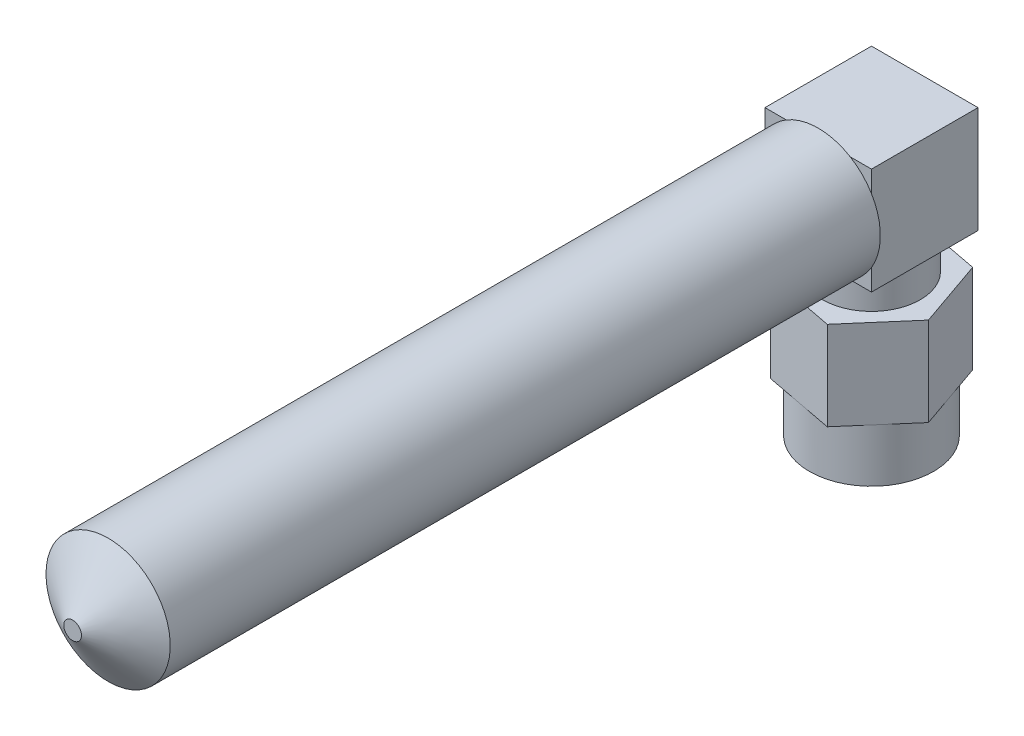
ISO-10303-21;
HEADER;
FILE_DESCRIPTION(('STEP AP214'),'2;1');
FILE_NAME('part.step','',(''),(''),'','','');
FILE_SCHEMA(('AUTOMOTIVE_DESIGN { 1 0 10303 214 1 1 1 1 }'));
ENDSEC;
DATA;
#1=APPLICATION_CONTEXT('core data for automotive mechanical design processes');
#2=APPLICATION_PROTOCOL_DEFINITION('international standard','automotive_design',2000,#1);
#3=PRODUCT_CONTEXT('',#1,'mechanical');
#4=PRODUCT('Part','Part','',(#3));
#5=PRODUCT_RELATED_PRODUCT_CATEGORY('part','',(#4));
#6=PRODUCT_DEFINITION_FORMATION('','',#4);
#7=PRODUCT_DEFINITION_CONTEXT('part definition',#1,'design');
#8=PRODUCT_DEFINITION('design','',#6,#7);
#9=PRODUCT_DEFINITION_SHAPE('','',#8);
#10=(LENGTH_UNIT() NAMED_UNIT(*) SI_UNIT(.MILLI.,.METRE.));
#11=(NAMED_UNIT(*) PLANE_ANGLE_UNIT() SI_UNIT($,.RADIAN.));
#12=(NAMED_UNIT(*) SI_UNIT($,.STERADIAN.) SOLID_ANGLE_UNIT());
#13=UNCERTAINTY_MEASURE_WITH_UNIT(LENGTH_MEASURE(1.E-05),#10,'distance_accuracy_value','');
#14=(GEOMETRIC_REPRESENTATION_CONTEXT(3) GLOBAL_UNCERTAINTY_ASSIGNED_CONTEXT((#13)) GLOBAL_UNIT_ASSIGNED_CONTEXT((#10,
#11,#12)) REPRESENTATION_CONTEXT('',''));
#15=CARTESIAN_POINT('',(0.,0.,0.));
#16=DIRECTION('',(0.,0.,1.));
#17=DIRECTION('',(1.,0.,0.));
#18=AXIS2_PLACEMENT_3D('',#15,#16,#17);
#19=CARTESIAN_POINT('',(3.,16.,3.));
#20=DIRECTION('',(0.,0.,-1.));
#21=DIRECTION('',(-1.,0.,0.));
#22=AXIS2_PLACEMENT_3D('',#19,#20,#21);
#23=PLANE('',#22);
#24=CARTESIAN_POINT('',(0.,13.,3.));
#25=DIRECTION('',(0.,0.,1.));
#26=DIRECTION('',(1.,0.,0.));
#27=AXIS2_PLACEMENT_3D('',#24,#25,#26);
#28=CIRCLE('',#27,3.5);
#29=CARTESIAN_POINT('',(3.,14.802775637732,3.));
#30=VERTEX_POINT('',#29);
#31=CARTESIAN_POINT('',(1.802775637732,16.,3.));
#32=VERTEX_POINT('',#31);
#33=EDGE_CURVE('E192',#30,#32,#28,.T.);
#34=ORIENTED_EDGE('',*,*,#33,.F.);
#35=DIRECTION('',(0.,-1.,0.));
#36=VECTOR('',#35,1.);
#37=CARTESIAN_POINT('',(3.,16.,3.));
#38=LINE('',#37,#36);
#39=CARTESIAN_POINT('',(3.,16.,3.));
#40=VERTEX_POINT('',#39);
#41=EDGE_CURVE('E170',#40,#30,#38,.T.);
#42=ORIENTED_EDGE('',*,*,#41,.F.);
#43=DIRECTION('',(1.,0.,0.));
#44=VECTOR('',#43,1.);
#45=CARTESIAN_POINT('',(3.,16.,3.));
#46=LINE('',#45,#44);
#47=EDGE_CURVE('E456',#32,#40,#46,.T.);
#48=ORIENTED_EDGE('',*,*,#47,.F.);
#49=EDGE_LOOP('',(#34,#42,#48));
#50=FACE_BOUND('',#49,.T.);
#51=ADVANCED_FACE('F39',(#50),#23,.F.);
#52=CARTESIAN_POINT('',(-1.802775637732,16.,3.));
#53=VERTEX_POINT('',#52);
#54=CARTESIAN_POINT('',(-3.,14.802775637732,3.));
#55=VERTEX_POINT('',#54);
#56=EDGE_CURVE('E11',#53,#55,#28,.T.);
#57=ORIENTED_EDGE('',*,*,#56,.F.);
#58=CARTESIAN_POINT('',(-3.,16.,3.));
#59=VERTEX_POINT('',#58);
#60=EDGE_CURVE('E452',#59,#53,#46,.T.);
#61=ORIENTED_EDGE('',*,*,#60,.F.);
#62=DIRECTION('',(0.,-1.,0.));
#63=VECTOR('',#62,1.);
#64=CARTESIAN_POINT('',(-3.,16.,3.));
#65=LINE('',#64,#63);
#66=EDGE_CURVE('E417',#59,#55,#65,.T.);
#67=ORIENTED_EDGE('',*,*,#66,.T.);
#68=EDGE_LOOP('',(#57,#61,#67));
#69=FACE_BOUND('',#68,.T.);
#70=ADVANCED_FACE('F245',(#69),#23,.F.);
#71=CARTESIAN_POINT('',(-3.,11.197224362268,3.));
#72=VERTEX_POINT('',#71);
#73=CARTESIAN_POINT('',(-1.80277563773199,10.,3.));
#74=VERTEX_POINT('',#73);
#75=EDGE_CURVE('E49',#72,#74,#28,.T.);
#76=ORIENTED_EDGE('',*,*,#75,.F.);
#77=CARTESIAN_POINT('',(-3.,10.,3.));
#78=VERTEX_POINT('',#77);
#79=EDGE_CURVE('E422',#72,#78,#65,.T.);
#80=ORIENTED_EDGE('',*,*,#79,.T.);
#81=DIRECTION('',(1.,0.,0.));
#82=VECTOR('',#81,1.);
#83=CARTESIAN_POINT('',(3.,10.,3.));
#84=LINE('',#83,#82);
#85=EDGE_CURVE('E440',#78,#74,#84,.T.);
#86=ORIENTED_EDGE('',*,*,#85,.T.);
#87=EDGE_LOOP('',(#76,#80,#86));
#88=FACE_BOUND('',#87,.T.);
#89=ADVANCED_FACE('F251',(#88),#23,.F.);
#90=CARTESIAN_POINT('',(0.,3.,0.));
#91=DIRECTION('',(0.,-1.,0.));
#92=DIRECTION('',(0.,0.,-1.));
#93=AXIS2_PLACEMENT_3D('',#90,#91,#92);
#94=CYLINDRICAL_SURFACE('',#93,3.5);
#95=CARTESIAN_POINT('',(0.,3.,0.));
#96=DIRECTION('',(0.,1.,0.));
#97=DIRECTION('',(0.,0.,1.));
#98=AXIS2_PLACEMENT_3D('',#95,#96,#97);
#99=CIRCLE('',#98,3.5);
#100=CARTESIAN_POINT('',(2.64807249743795,3.,2.28860482572084));
#101=VERTEX_POINT('',#100);
#102=CARTESIAN_POINT('',(3.30602616701688,3.,-1.14899564098375));
#103=VERTEX_POINT('',#102);
#104=EDGE_CURVE('E201',#101,#103,#99,.T.);
#105=ORIENTED_EDGE('',*,*,#104,.F.);
#106=CARTESIAN_POINT('',(-0.657953669578931,3.,3.43760046670459));
#107=VERTEX_POINT('',#106);
#108=EDGE_CURVE('E281',#107,#101,#99,.T.);
#109=ORIENTED_EDGE('',*,*,#108,.F.);
#110=CARTESIAN_POINT('',(-3.30602616701688,3.,1.14899564098375));
#111=VERTEX_POINT('',#110);
#112=EDGE_CURVE('E285',#111,#107,#99,.T.);
#113=ORIENTED_EDGE('',*,*,#112,.F.);
#114=CARTESIAN_POINT('',(-2.64807249743795,3.,-2.28860482572084));
#115=VERTEX_POINT('',#114);
#116=EDGE_CURVE('E311',#115,#111,#99,.T.);
#117=ORIENTED_EDGE('',*,*,#116,.F.);
#118=CARTESIAN_POINT('',(0.657953669578931,3.,-3.43760046670459));
#119=VERTEX_POINT('',#118);
#120=EDGE_CURVE('E305',#119,#115,#99,.T.);
#121=ORIENTED_EDGE('',*,*,#120,.F.);
#122=EDGE_CURVE('E298',#103,#119,#99,.T.);
#123=ORIENTED_EDGE('',*,*,#122,.F.);
#124=EDGE_LOOP('',(#105,#109,#113,#117,#121,#123));
#125=FACE_BOUND('',#124,.T.);
#126=CARTESIAN_POINT('',(0.,0.,0.));
#127=DIRECTION('',(0.,1.,0.));
#128=DIRECTION('',(0.,0.,1.));
#129=AXIS2_PLACEMENT_3D('',#126,#127,#128);
#130=CIRCLE('',#129,3.5);
#131=CARTESIAN_POINT('',(0.,0.,3.5));
#132=VERTEX_POINT('',#131);
#133=EDGE_CURVE('E43',#132,#132,#130,.T.);
#134=ORIENTED_EDGE('',*,*,#133,.T.);
#135=EDGE_LOOP('',(#134));
#136=FACE_BOUND('',#135,.T.);
#137=ADVANCED_FACE('F41',(#125,#136),#94,.T.);
#138=CARTESIAN_POINT('',(0.,0.,0.));
#139=DIRECTION('',(0.,1.,0.));
#140=DIRECTION('',(0.,0.,1.));
#141=AXIS2_PLACEMENT_3D('',#138,#139,#140);
#142=PLANE('',#141);
#143=CARTESIAN_POINT('',(0.,0.,0.));
#144=DIRECTION('',(0.,-1.,0.));
#145=DIRECTION('',(0.,0.,-1.));
#146=AXIS2_PLACEMENT_3D('',#143,#144,#145);
#147=CIRCLE('',#146,2.5);
#148=CARTESIAN_POINT('',(0.,0.,-2.5));
#149=VERTEX_POINT('',#148);
#150=EDGE_CURVE('E413',#149,#149,#147,.T.);
#151=ORIENTED_EDGE('',*,*,#150,.F.);
#152=EDGE_LOOP('',(#151));
#153=FACE_BOUND('',#152,.T.);
#154=ORIENTED_EDGE('',*,*,#133,.F.);
#155=EDGE_LOOP('',(#154));
#156=FACE_BOUND('',#155,.T.);
#157=ADVANCED_FACE('F267',(#153,#156),#142,.F.);
#158=CARTESIAN_POINT('',(0.,3.,0.));
#159=DIRECTION('',(0.,1.,0.));
#160=DIRECTION('',(0.,0.,1.));
#161=AXIS2_PLACEMENT_3D('',#158,#159,#160);
#162=PLANE('',#161);
#163=DIRECTION('',(0.653887093063098,0.,-0.75659214212513));
#164=VECTOR('',#163,1.);
#165=CARTESIAN_POINT('',(1.32674588523935,3.,3.81747019495029));
#166=LINE('',#165,#164);
#167=CARTESIAN_POINT('',(3.96939910963656,3.,0.759739456491395));
#168=VERTEX_POINT('',#167);
#169=EDGE_CURVE('E348',#101,#168,#166,.T.);
#170=ORIENTED_EDGE('',*,*,#169,.F.);
#171=ORIENTED_EDGE('',*,*,#104,.T.);
#172=DIRECTION('',(-0.3282844688525,0.,-0.944578904861966));
#173=VECTOR('',#172,1.);
#174=CARTESIAN_POINT('',(3.96939910963656,3.,0.759739456491395));
#175=LINE('',#174,#173);
#176=EDGE_CURVE('E387',#168,#103,#175,.T.);
#177=ORIENTED_EDGE('',*,*,#176,.F.);
#178=EDGE_LOOP('',(#170,#171,#177));
#179=FACE_BOUND('',#178,.T.);
#180=ADVANCED_FACE('F272',(#179),#162,.F.);
#181=CARTESIAN_POINT('',(2.64265322439721,3.,-3.05773073845889));
#182=VERTEX_POINT('',#181);
#183=EDGE_CURVE('E391',#103,#182,#175,.T.);
#184=ORIENTED_EDGE('',*,*,#183,.F.);
#185=ORIENTED_EDGE('',*,*,#122,.T.);
#186=DIRECTION('',(-0.982171561915597,0.,-0.187986762736838));
#187=VECTOR('',#186,1.);
#188=CARTESIAN_POINT('',(2.64265322439721,3.,-3.05773073845889));
#189=LINE('',#188,#187);
#190=EDGE_CURVE('E382',#182,#119,#189,.T.);
#191=ORIENTED_EDGE('',*,*,#190,.F.);
#192=EDGE_LOOP('',(#184,#185,#191));
#193=FACE_BOUND('',#192,.T.);
#194=ADVANCED_FACE('F705',(#193),#162,.F.);
#195=CARTESIAN_POINT('',(-1.32674588523935,3.,-3.81747019495029));
#196=VERTEX_POINT('',#195);
#197=EDGE_CURVE('E386',#119,#196,#189,.T.);
#198=ORIENTED_EDGE('',*,*,#197,.F.);
#199=ORIENTED_EDGE('',*,*,#120,.T.);
#200=DIRECTION('',(-0.653887093063097,0.,0.75659214212513));
#201=VECTOR('',#200,1.);
#202=CARTESIAN_POINT('',(-1.32674588523935,3.,-3.81747019495029));
#203=LINE('',#202,#201);
#204=EDGE_CURVE('E379',#196,#115,#203,.T.);
#205=ORIENTED_EDGE('',*,*,#204,.F.);
#206=EDGE_LOOP('',(#198,#199,#205));
#207=FACE_BOUND('',#206,.T.);
#208=ADVANCED_FACE('F697',(#207),#162,.F.);
#209=CARTESIAN_POINT('',(-3.96939910963656,3.,-0.759739456491394));
#210=VERTEX_POINT('',#209);
#211=EDGE_CURVE('E375',#115,#210,#203,.T.);
#212=ORIENTED_EDGE('',*,*,#211,.F.);
#213=ORIENTED_EDGE('',*,*,#116,.T.);
#214=DIRECTION('',(0.3282844688525,0.,0.944578904861966));
#215=VECTOR('',#214,1.);
#216=CARTESIAN_POINT('',(-3.96939910963656,3.,-0.759739456491394));
#217=LINE('',#216,#215);
#218=EDGE_CURVE('E340',#210,#111,#217,.T.);
#219=ORIENTED_EDGE('',*,*,#218,.F.);
#220=EDGE_LOOP('',(#212,#213,#219));
#221=FACE_BOUND('',#220,.T.);
#222=ADVANCED_FACE('F374',(#221),#162,.F.);
#223=CARTESIAN_POINT('',(-2.64265322439721,3.,3.05773073845889));
#224=VERTEX_POINT('',#223);
#225=EDGE_CURVE('E328',#111,#224,#217,.T.);
#226=ORIENTED_EDGE('',*,*,#225,.F.);
#227=ORIENTED_EDGE('',*,*,#112,.T.);
#228=DIRECTION('',(0.982171561915597,0.,0.187986762736837));
#229=VECTOR('',#228,1.);
#230=CARTESIAN_POINT('',(-2.64265322439721,3.,3.05773073845889));
#231=LINE('',#230,#229);
#232=EDGE_CURVE('E327',#224,#107,#231,.T.);
#233=ORIENTED_EDGE('',*,*,#232,.F.);
#234=EDGE_LOOP('',(#226,#227,#233));
#235=FACE_BOUND('',#234,.T.);
#236=ADVANCED_FACE('F325',(#235),#162,.F.);
#237=CARTESIAN_POINT('',(1.32674588523935,3.,3.81747019495029));
#238=VERTEX_POINT('',#237);
#239=EDGE_CURVE('E332',#107,#238,#231,.T.);
#240=ORIENTED_EDGE('',*,*,#239,.F.);
#241=ORIENTED_EDGE('',*,*,#108,.T.);
#242=EDGE_CURVE('E335',#238,#101,#166,.T.);
#243=ORIENTED_EDGE('',*,*,#242,.F.);
#244=EDGE_LOOP('',(#240,#241,#243));
#245=FACE_BOUND('',#244,.T.);
#246=ADVANCED_FACE('F333',(#245),#162,.F.);
#247=CARTESIAN_POINT('',(3.96939910963656,8.,0.759739456491395));
#248=DIRECTION('',(-0.944578904861966,0.,0.3282844688525));
#249=DIRECTION('',(0.3282844688525,0.,0.944578904861967));
#250=AXIS2_PLACEMENT_3D('',#247,#248,#249);
#251=PLANE('',#250);
#252=ORIENTED_EDGE('',*,*,#176,.T.);
#253=ORIENTED_EDGE('',*,*,#183,.T.);
#254=DIRECTION('',(0.,-1.,0.));
#255=VECTOR('',#254,1.);
#256=CARTESIAN_POINT('',(2.64265322439721,8.,-3.05773073845889));
#257=LINE('',#256,#255);
#258=CARTESIAN_POINT('',(2.64265322439721,8.,-3.05773073845889));
#259=VERTEX_POINT('',#258);
#260=EDGE_CURVE('E282',#259,#182,#257,.T.);
#261=ORIENTED_EDGE('',*,*,#260,.F.);
#262=DIRECTION('',(-0.3282844688525,0.,-0.944578904861966));
#263=VECTOR('',#262,1.);
#264=CARTESIAN_POINT('',(3.96939910963656,8.,0.759739456491395));
#265=LINE('',#264,#263);
#266=CARTESIAN_POINT('',(3.96939910963656,8.,0.759739456491395));
#267=VERTEX_POINT('',#266);
#268=EDGE_CURVE('E355',#267,#259,#265,.T.);
#269=ORIENTED_EDGE('',*,*,#268,.F.);
#270=DIRECTION('',(0.,-1.,0.));
#271=VECTOR('',#270,1.);
#272=CARTESIAN_POINT('',(3.96939910963656,8.,0.759739456491395));
#273=LINE('',#272,#271);
#274=EDGE_CURVE('E356',#267,#168,#273,.T.);
#275=ORIENTED_EDGE('',*,*,#274,.T.);
#276=EDGE_LOOP('',(#252,#253,#261,#269,#275));
#277=FACE_BOUND('',#276,.T.);
#278=ADVANCED_FACE('F664',(#277),#251,.F.);
#279=CARTESIAN_POINT('',(2.64265322439721,8.,-3.05773073845889));
#280=DIRECTION('',(-0.187986762736837,0.,0.982171561915597));
#281=DIRECTION('',(0.982171561915597,0.,0.187986762736837));
#282=AXIS2_PLACEMENT_3D('',#279,#280,#281);
#283=PLANE('',#282);
#284=ORIENTED_EDGE('',*,*,#190,.T.);
#285=ORIENTED_EDGE('',*,*,#197,.T.);
#286=DIRECTION('',(0.,-1.,0.));
#287=VECTOR('',#286,1.);
#288=CARTESIAN_POINT('',(-1.32674588523935,8.,-3.81747019495029));
#289=LINE('',#288,#287);
#290=CARTESIAN_POINT('',(-1.32674588523935,8.,-3.81747019495029));
#291=VERTEX_POINT('',#290);
#292=EDGE_CURVE('E287',#291,#196,#289,.T.);
#293=ORIENTED_EDGE('',*,*,#292,.F.);
#294=DIRECTION('',(-0.982171561915597,0.,-0.187986762736838));
#295=VECTOR('',#294,1.);
#296=CARTESIAN_POINT('',(2.64265322439721,8.,-3.05773073845889));
#297=LINE('',#296,#295);
#298=EDGE_CURVE('E402',#259,#291,#297,.T.);
#299=ORIENTED_EDGE('',*,*,#298,.F.);
#300=ORIENTED_EDGE('',*,*,#260,.T.);
#301=EDGE_LOOP('',(#284,#285,#293,#299,#300));
#302=FACE_BOUND('',#301,.T.);
#303=ADVANCED_FACE('F655',(#302),#283,.F.);
#304=CARTESIAN_POINT('',(-1.32674588523935,8.,-3.81747019495029));
#305=DIRECTION('',(0.75659214212513,0.,0.653887093063097));
#306=DIRECTION('',(0.653887093063097,0.,-0.75659214212513));
#307=AXIS2_PLACEMENT_3D('',#304,#305,#306);
#308=PLANE('',#307);
#309=ORIENTED_EDGE('',*,*,#204,.T.);
#310=ORIENTED_EDGE('',*,*,#211,.T.);
#311=DIRECTION('',(0.,-1.,0.));
#312=VECTOR('',#311,1.);
#313=CARTESIAN_POINT('',(-3.96939910963656,8.,-0.759739456491394));
#314=LINE('',#313,#312);
#315=CARTESIAN_POINT('',(-3.96939910963656,8.,-0.759739456491394));
#316=VERTEX_POINT('',#315);
#317=EDGE_CURVE('E294',#316,#210,#314,.T.);
#318=ORIENTED_EDGE('',*,*,#317,.F.);
#319=DIRECTION('',(-0.653887093063097,0.,0.75659214212513));
#320=VECTOR('',#319,1.);
#321=CARTESIAN_POINT('',(-1.32674588523935,8.,-3.81747019495029));
#322=LINE('',#321,#320);
#323=EDGE_CURVE('E399',#291,#316,#322,.T.);
#324=ORIENTED_EDGE('',*,*,#323,.F.);
#325=ORIENTED_EDGE('',*,*,#292,.T.);
#326=EDGE_LOOP('',(#309,#310,#318,#324,#325));
#327=FACE_BOUND('',#326,.T.);
#328=ADVANCED_FACE('F646',(#327),#308,.F.);
#329=CARTESIAN_POINT('',(-3.96939910963656,8.,-0.759739456491394));
#330=DIRECTION('',(0.944578904861966,0.,-0.3282844688525));
#331=DIRECTION('',(-0.3282844688525,0.,-0.944578904861966));
#332=AXIS2_PLACEMENT_3D('',#329,#330,#331);
#333=PLANE('',#332);
#334=ORIENTED_EDGE('',*,*,#218,.T.);
#335=ORIENTED_EDGE('',*,*,#225,.T.);
#336=DIRECTION('',(0.,-1.,0.));
#337=VECTOR('',#336,1.);
#338=CARTESIAN_POINT('',(-2.64265322439721,8.,3.05773073845889));
#339=LINE('',#338,#337);
#340=CARTESIAN_POINT('',(-2.64265322439721,8.,3.05773073845889));
#341=VERTEX_POINT('',#340);
#342=EDGE_CURVE('E346',#341,#224,#339,.T.);
#343=ORIENTED_EDGE('',*,*,#342,.F.);
#344=DIRECTION('',(0.3282844688525,0.,0.944578904861966));
#345=VECTOR('',#344,1.);
#346=CARTESIAN_POINT('',(-3.96939910963656,8.,-0.759739456491394));
#347=LINE('',#346,#345);
#348=EDGE_CURVE('E371',#316,#341,#347,.T.);
#349=ORIENTED_EDGE('',*,*,#348,.F.);
#350=ORIENTED_EDGE('',*,*,#317,.T.);
#351=EDGE_LOOP('',(#334,#335,#343,#349,#350));
#352=FACE_BOUND('',#351,.T.);
#353=ADVANCED_FACE('F370',(#352),#333,.F.);
#354=CARTESIAN_POINT('',(-2.64265322439721,8.,3.05773073845889));
#355=DIRECTION('',(0.187986762736837,0.,-0.982171561915598));
#356=DIRECTION('',(-0.982171561915597,0.,-0.187986762736837));
#357=AXIS2_PLACEMENT_3D('',#354,#355,#356);
#358=PLANE('',#357);
#359=ORIENTED_EDGE('',*,*,#232,.T.);
#360=ORIENTED_EDGE('',*,*,#239,.T.);
#361=DIRECTION('',(0.,-1.,0.));
#362=VECTOR('',#361,1.);
#363=CARTESIAN_POINT('',(1.32674588523935,8.,3.81747019495029));
#364=LINE('',#363,#362);
#365=CARTESIAN_POINT('',(1.32674588523935,8.,3.81747019495029));
#366=VERTEX_POINT('',#365);
#367=EDGE_CURVE('E360',#366,#238,#364,.T.);
#368=ORIENTED_EDGE('',*,*,#367,.F.);
#369=DIRECTION('',(0.982171561915597,0.,0.187986762736837));
#370=VECTOR('',#369,1.);
#371=CARTESIAN_POINT('',(-2.64265322439721,8.,3.05773073845889));
#372=LINE('',#371,#370);
#373=EDGE_CURVE('E394',#341,#366,#372,.T.);
#374=ORIENTED_EDGE('',*,*,#373,.F.);
#375=ORIENTED_EDGE('',*,*,#342,.T.);
#376=EDGE_LOOP('',(#359,#360,#368,#374,#375));
#377=FACE_BOUND('',#376,.T.);
#378=ADVANCED_FACE('F343',(#377),#358,.F.);
#379=CARTESIAN_POINT('',(1.32674588523935,8.,3.81747019495029));
#380=DIRECTION('',(-0.75659214212513,0.,-0.653887093063098));
#381=DIRECTION('',(-0.653887093063098,0.,0.75659214212513));
#382=AXIS2_PLACEMENT_3D('',#379,#380,#381);
#383=PLANE('',#382);
#384=ORIENTED_EDGE('',*,*,#242,.T.);
#385=ORIENTED_EDGE('',*,*,#169,.T.);
#386=ORIENTED_EDGE('',*,*,#274,.F.);
#387=DIRECTION('',(0.653887093063098,0.,-0.75659214212513));
#388=VECTOR('',#387,1.);
#389=CARTESIAN_POINT('',(1.32674588523935,8.,3.81747019495029));
#390=LINE('',#389,#388);
#391=EDGE_CURVE('E361',#366,#267,#390,.T.);
#392=ORIENTED_EDGE('',*,*,#391,.F.);
#393=ORIENTED_EDGE('',*,*,#367,.T.);
#394=EDGE_LOOP('',(#384,#385,#386,#392,#393));
#395=FACE_BOUND('',#394,.T.);
#396=ADVANCED_FACE('F619',(#395),#383,.F.);
#397=CARTESIAN_POINT('',(0.,8.,0.));
#398=DIRECTION('',(0.,1.,0.));
#399=DIRECTION('',(0.,0.,1.));
#400=AXIS2_PLACEMENT_3D('',#397,#398,#399);
#401=PLANE('',#400);
#402=CARTESIAN_POINT('',(0.,8.,0.));
#403=DIRECTION('',(0.,1.,0.));
#404=DIRECTION('',(0.,0.,1.));
#405=AXIS2_PLACEMENT_3D('',#402,#403,#404);
#406=CIRCLE('',#405,2.75);
#407=CARTESIAN_POINT('',(0.,8.,2.75));
#408=VERTEX_POINT('',#407);
#409=EDGE_CURVE('E197',#408,#408,#406,.T.);
#410=ORIENTED_EDGE('',*,*,#409,.F.);
#411=EDGE_LOOP('',(#410));
#412=FACE_BOUND('',#411,.T.);
#413=ORIENTED_EDGE('',*,*,#268,.T.);
#414=ORIENTED_EDGE('',*,*,#298,.T.);
#415=ORIENTED_EDGE('',*,*,#323,.T.);
#416=ORIENTED_EDGE('',*,*,#348,.T.);
#417=ORIENTED_EDGE('',*,*,#373,.T.);
#418=ORIENTED_EDGE('',*,*,#391,.T.);
#419=EDGE_LOOP('',(#413,#414,#415,#416,#417,#418));
#420=FACE_BOUND('',#419,.T.);
#421=ADVANCED_FACE('F609',(#412,#420),#401,.T.);
#422=CARTESIAN_POINT('',(0.,10.,0.));
#423=DIRECTION('',(0.,-1.,0.));
#424=DIRECTION('',(0.,0.,-1.));
#425=AXIS2_PLACEMENT_3D('',#422,#423,#424);
#426=CYLINDRICAL_SURFACE('',#425,2.75);
#427=CARTESIAN_POINT('',(0.,10.,0.));
#428=DIRECTION('',(0.,1.,0.));
#429=DIRECTION('',(0.,0.,1.));
#430=AXIS2_PLACEMENT_3D('',#427,#428,#429);
#431=CIRCLE('',#430,2.75);
#432=CARTESIAN_POINT('',(0.,10.,2.75));
#433=VERTEX_POINT('',#432);
#434=EDGE_CURVE('E408',#433,#433,#431,.T.);
#435=ORIENTED_EDGE('',*,*,#434,.F.);
#436=EDGE_LOOP('',(#435));
#437=FACE_BOUND('',#436,.T.);
#438=ORIENTED_EDGE('',*,*,#409,.T.);
#439=EDGE_LOOP('',(#438));
#440=FACE_BOUND('',#439,.T.);
#441=ADVANCED_FACE('F590',(#437,#440),#426,.T.);
#442=CARTESIAN_POINT('',(0.,5.,0.));
#443=DIRECTION('',(0.,-1.,0.));
#444=DIRECTION('',(0.,0.,-1.));
#445=AXIS2_PLACEMENT_3D('',#442,#443,#444);
#446=CYLINDRICAL_SURFACE('',#445,2.5);
#447=CARTESIAN_POINT('',(0.,5.,0.));
#448=DIRECTION('',(0.,-1.,0.));
#449=DIRECTION('',(0.,0.,-1.));
#450=AXIS2_PLACEMENT_3D('',#447,#448,#449);
#451=CIRCLE('',#450,2.5);
#452=CARTESIAN_POINT('',(0.,5.,-2.5));
#453=VERTEX_POINT('',#452);
#454=EDGE_CURVE('E412',#453,#453,#451,.T.);
#455=ORIENTED_EDGE('',*,*,#454,.F.);
#456=EDGE_LOOP('',(#455));
#457=FACE_BOUND('',#456,.T.);
#458=ORIENTED_EDGE('',*,*,#150,.T.);
#459=EDGE_LOOP('',(#458));
#460=FACE_BOUND('',#459,.T.);
#461=ADVANCED_FACE('F580',(#457,#460),#446,.F.);
#462=CARTESIAN_POINT('',(0.,5.,0.));
#463=DIRECTION('',(0.,-1.,0.));
#464=DIRECTION('',(0.,0.,-1.));
#465=AXIS2_PLACEMENT_3D('',#462,#463,#464);
#466=PLANE('',#465);
#467=ORIENTED_EDGE('',*,*,#454,.T.);
#468=EDGE_LOOP('',(#467));
#469=FACE_BOUND('',#468,.T.);
#470=ADVANCED_FACE('F262',(#469),#466,.T.);
#471=CARTESIAN_POINT('',(-3.,16.,3.));
#472=DIRECTION('',(1.,0.,0.));
#473=DIRECTION('',(0.,0.,-1.));
#474=AXIS2_PLACEMENT_3D('',#471,#472,#473);
#475=PLANE('',#474);
#476=DIRECTION('',(0.,0.,1.));
#477=VECTOR('',#476,1.);
#478=CARTESIAN_POINT('',(-3.,10.,3.));
#479=LINE('',#478,#477);
#480=CARTESIAN_POINT('',(-3.,10.,-3.));
#481=VERTEX_POINT('',#480);
#482=EDGE_CURVE('E211',#481,#78,#479,.T.);
#483=ORIENTED_EDGE('',*,*,#482,.T.);
#484=ORIENTED_EDGE('',*,*,#79,.F.);
#485=EDGE_CURVE('E64',#55,#72,#65,.T.);
#486=ORIENTED_EDGE('',*,*,#485,.F.);
#487=ORIENTED_EDGE('',*,*,#66,.F.);
#488=DIRECTION('',(0.,0.,1.));
#489=VECTOR('',#488,1.);
#490=CARTESIAN_POINT('',(-3.,16.,3.));
#491=LINE('',#490,#489);
#492=CARTESIAN_POINT('',(-3.,16.,-3.));
#493=VERTEX_POINT('',#492);
#494=EDGE_CURVE('E436',#493,#59,#491,.T.);
#495=ORIENTED_EDGE('',*,*,#494,.F.);
#496=DIRECTION('',(0.,-1.,0.));
#497=VECTOR('',#496,1.);
#498=CARTESIAN_POINT('',(-3.,16.,-3.));
#499=LINE('',#498,#497);
#500=EDGE_CURVE('E428',#493,#481,#499,.T.);
#501=ORIENTED_EDGE('',*,*,#500,.T.);
#502=EDGE_LOOP('',(#483,#484,#486,#487,#495,#501));
#503=FACE_BOUND('',#502,.T.);
#504=ADVANCED_FACE('F256',(#503),#475,.F.);
#505=CARTESIAN_POINT('',(1.80277563773199,10.,3.));
#506=VERTEX_POINT('',#505);
#507=CARTESIAN_POINT('',(3.,11.197224362268,3.));
#508=VERTEX_POINT('',#507);
#509=EDGE_CURVE('E179',#506,#508,#28,.T.);
#510=ORIENTED_EDGE('',*,*,#509,.F.);
#511=CARTESIAN_POINT('',(3.,10.,3.));
#512=VERTEX_POINT('',#511);
#513=EDGE_CURVE('E181',#506,#512,#84,.T.);
#514=ORIENTED_EDGE('',*,*,#513,.T.);
#515=EDGE_CURVE('E166',#508,#512,#38,.T.);
#516=ORIENTED_EDGE('',*,*,#515,.F.);
#517=EDGE_LOOP('',(#510,#514,#516));
#518=FACE_BOUND('',#517,.T.);
#519=ADVANCED_FACE('F177',(#518),#23,.F.);
#520=CARTESIAN_POINT('',(3.,16.,3.));
#521=DIRECTION('',(-1.,0.,0.));
#522=DIRECTION('',(0.,0.,1.));
#523=AXIS2_PLACEMENT_3D('',#520,#521,#522);
#524=PLANE('',#523);
#525=DIRECTION('',(0.,0.,-1.));
#526=VECTOR('',#525,1.);
#527=CARTESIAN_POINT('',(3.,10.,3.));
#528=LINE('',#527,#526);
#529=CARTESIAN_POINT('',(3.,10.,-3.));
#530=VERTEX_POINT('',#529);
#531=EDGE_CURVE('E437',#512,#530,#528,.T.);
#532=ORIENTED_EDGE('',*,*,#531,.T.);
#533=DIRECTION('',(0.,-1.,0.));
#534=VECTOR('',#533,1.);
#535=CARTESIAN_POINT('',(3.,16.,-3.));
#536=LINE('',#535,#534);
#537=CARTESIAN_POINT('',(3.,16.,-3.));
#538=VERTEX_POINT('',#537);
#539=EDGE_CURVE('E184',#538,#530,#536,.T.);
#540=ORIENTED_EDGE('',*,*,#539,.F.);
#541=DIRECTION('',(0.,0.,-1.));
#542=VECTOR('',#541,1.);
#543=CARTESIAN_POINT('',(3.,16.,3.));
#544=LINE('',#543,#542);
#545=EDGE_CURVE('E449',#40,#538,#544,.T.);
#546=ORIENTED_EDGE('',*,*,#545,.F.);
#547=ORIENTED_EDGE('',*,*,#41,.T.);
#548=EDGE_CURVE('E163',#30,#508,#38,.T.);
#549=ORIENTED_EDGE('',*,*,#548,.T.);
#550=ORIENTED_EDGE('',*,*,#515,.T.);
#551=EDGE_LOOP('',(#532,#540,#546,#547,#549,#550));
#552=FACE_BOUND('',#551,.T.);
#553=ADVANCED_FACE('F165',(#552),#524,.F.);
#554=CARTESIAN_POINT('',(3.,16.,-3.));
#555=DIRECTION('',(0.,0.,1.));
#556=DIRECTION('',(1.,0.,0.));
#557=AXIS2_PLACEMENT_3D('',#554,#555,#556);
#558=PLANE('',#557);
#559=DIRECTION('',(-1.,0.,0.));
#560=VECTOR('',#559,1.);
#561=CARTESIAN_POINT('',(3.,10.,-3.));
#562=LINE('',#561,#560);
#563=EDGE_CURVE('E433',#530,#481,#562,.T.);
#564=ORIENTED_EDGE('',*,*,#563,.T.);
#565=ORIENTED_EDGE('',*,*,#500,.F.);
#566=DIRECTION('',(-1.,0.,0.));
#567=VECTOR('',#566,1.);
#568=CARTESIAN_POINT('',(3.,16.,-3.));
#569=LINE('',#568,#567);
#570=EDGE_CURVE('E432',#538,#493,#569,.T.);
#571=ORIENTED_EDGE('',*,*,#570,.F.);
#572=ORIENTED_EDGE('',*,*,#539,.T.);
#573=EDGE_LOOP('',(#564,#565,#571,#572));
#574=FACE_BOUND('',#573,.T.);
#575=ADVANCED_FACE('F261',(#574),#558,.F.);
#576=CARTESIAN_POINT('',(0.,16.,0.));
#577=DIRECTION('',(0.,1.,0.));
#578=DIRECTION('',(0.,0.,1.));
#579=AXIS2_PLACEMENT_3D('',#576,#577,#578);
#580=PLANE('',#579);
#581=ORIENTED_EDGE('',*,*,#494,.T.);
#582=ORIENTED_EDGE('',*,*,#60,.T.);
#583=EDGE_CURVE('E455',#53,#32,#46,.T.);
#584=ORIENTED_EDGE('',*,*,#583,.T.);
#585=ORIENTED_EDGE('',*,*,#47,.T.);
#586=ORIENTED_EDGE('',*,*,#545,.T.);
#587=ORIENTED_EDGE('',*,*,#570,.T.);
#588=EDGE_LOOP('',(#581,#582,#584,#585,#586,#587));
#589=FACE_BOUND('',#588,.T.);
#590=ADVANCED_FACE('F465',(#589),#580,.T.);
#591=CARTESIAN_POINT('',(0.,10.,0.));
#592=DIRECTION('',(0.,1.,0.));
#593=DIRECTION('',(0.,0.,1.));
#594=AXIS2_PLACEMENT_3D('',#591,#592,#593);
#595=PLANE('',#594);
#596=ORIENTED_EDGE('',*,*,#434,.T.);
#597=EDGE_LOOP('',(#596));
#598=FACE_BOUND('',#597,.T.);
#599=ORIENTED_EDGE('',*,*,#482,.F.);
#600=ORIENTED_EDGE('',*,*,#563,.F.);
#601=ORIENTED_EDGE('',*,*,#531,.F.);
#602=ORIENTED_EDGE('',*,*,#513,.F.);
#603=EDGE_CURVE('E443',#74,#506,#84,.T.);
#604=ORIENTED_EDGE('',*,*,#603,.F.);
#605=ORIENTED_EDGE('',*,*,#85,.F.);
#606=EDGE_LOOP('',(#599,#600,#601,#602,#604,#605));
#607=FACE_BOUND('',#606,.T.);
#608=ADVANCED_FACE('F471',(#598,#607),#595,.F.);
#609=CARTESIAN_POINT('',(0.,13.,3.));
#610=DIRECTION('',(0.,0.,1.));
#611=DIRECTION('',(1.,0.,0.));
#612=AXIS2_PLACEMENT_3D('',#609,#610,#611);
#613=PLANE('',#612);
#614=EDGE_CURVE('E190',#74,#506,#28,.T.);
#615=ORIENTED_EDGE('',*,*,#614,.F.);
#616=ORIENTED_EDGE('',*,*,#603,.T.);
#617=EDGE_LOOP('',(#615,#616));
#618=FACE_BOUND('',#617,.T.);
#619=ADVANCED_FACE('F241',(#618),#613,.F.);
#620=ORIENTED_EDGE('',*,*,#548,.F.);
#621=EDGE_CURVE('E185',#508,#30,#28,.T.);
#622=ORIENTED_EDGE('',*,*,#621,.F.);
#623=EDGE_LOOP('',(#620,#622));
#624=FACE_BOUND('',#623,.T.);
#625=ADVANCED_FACE('F186',(#624),#613,.F.);
#626=EDGE_CURVE('E212',#55,#72,#28,.T.);
#627=ORIENTED_EDGE('',*,*,#626,.F.);
#628=ORIENTED_EDGE('',*,*,#485,.T.);
#629=EDGE_LOOP('',(#627,#628));
#630=FACE_BOUND('',#629,.T.);
#631=ADVANCED_FACE('F233',(#630),#613,.F.);
#632=CARTESIAN_POINT('',(0.,13.,43.));
#633=DIRECTION('',(0.,0.,-1.));
#634=DIRECTION('',(-1.,0.,0.));
#635=AXIS2_PLACEMENT_3D('',#632,#633,#634);
#636=CYLINDRICAL_SURFACE('',#635,3.5);
#637=CARTESIAN_POINT('',(0.,13.,43.));
#638=DIRECTION('',(0.,0.,1.));
#639=DIRECTION('',(1.,0.,0.));
#640=AXIS2_PLACEMENT_3D('',#637,#638,#639);
#641=CIRCLE('',#640,3.5);
#642=CARTESIAN_POINT('',(-3.5,13.,43.));
#643=VERTEX_POINT('',#642);
#644=EDGE_CURVE('E206',#643,#643,#641,.T.);
#645=ORIENTED_EDGE('',*,*,#644,.F.);
#646=EDGE_LOOP('',(#645));
#647=FACE_BOUND('',#646,.T.);
#648=ORIENTED_EDGE('',*,*,#33,.T.);
#649=EDGE_CURVE('E51',#32,#53,#28,.T.);
#650=ORIENTED_EDGE('',*,*,#649,.T.);
#651=ORIENTED_EDGE('',*,*,#56,.T.);
#652=ORIENTED_EDGE('',*,*,#626,.T.);
#653=ORIENTED_EDGE('',*,*,#75,.T.);
#654=ORIENTED_EDGE('',*,*,#614,.T.);
#655=ORIENTED_EDGE('',*,*,#509,.T.);
#656=ORIENTED_EDGE('',*,*,#621,.T.);
#657=EDGE_LOOP('',(#648,#650,#651,#652,#653,#654,#655,#656));
#658=FACE_BOUND('',#657,.T.);
#659=ADVANCED_FACE('F194',(#647,#658),#636,.T.);
#660=ORIENTED_EDGE('',*,*,#583,.F.);
#661=ORIENTED_EDGE('',*,*,#649,.F.);
#662=EDGE_LOOP('',(#660,#661));
#663=FACE_BOUND('',#662,.T.);
#664=ADVANCED_FACE('F228',(#663),#613,.F.);
#665=CARTESIAN_POINT('',(0.,13.,43.));
#666=DIRECTION('',(0.,0.,-1.));
#667=DIRECTION('',(-1.,0.,0.));
#668=AXIS2_PLACEMENT_3D('',#665,#666,#667);
#669=CONICAL_SURFACE('',#668,3.5,0.982793723247328);
#670=CARTESIAN_POINT('',(0.,13.,45.));
#671=DIRECTION('',(0.,0.,1.));
#672=DIRECTION('',(1.,0.,0.));
#673=AXIS2_PLACEMENT_3D('',#670,#671,#672);
#674=CIRCLE('',#673,0.5);
#675=CARTESIAN_POINT('',(-0.500000000000006,13.,45.));
#676=VERTEX_POINT('',#675);
#677=EDGE_CURVE('E191',#676,#676,#674,.T.);
#678=CARTESIAN_POINT('',(-0.500000000000006,13.,45.));
#679=CARTESIAN_POINT('',(-0.531250000000009,13.,44.9791666666667));
#680=CARTESIAN_POINT('',(-0.562500000000008,13.,44.9583333333333));
#681=CARTESIAN_POINT('',(-0.625000000000006,13.,44.9166666666667));
#682=CARTESIAN_POINT('',(-0.656250000000004,13.,44.8958333333333));
#683=CARTESIAN_POINT('',(-0.718750000000005,13.,44.8541666666667));
#684=CARTESIAN_POINT('',(-0.750000000000007,13.,44.8333333333333));
#685=CARTESIAN_POINT('',(-0.812500000000006,13.,44.7916666666667));
#686=CARTESIAN_POINT('',(-0.843750000000004,13.,44.7708333333333));
#687=CARTESIAN_POINT('',(-0.906250000000004,13.,44.7291666666667));
#688=CARTESIAN_POINT('',(-0.937500000000007,13.,44.7083333333333));
#689=CARTESIAN_POINT('',(-1.00000000000001,13.,44.6666666666667));
#690=CARTESIAN_POINT('',(-1.03125,13.,44.6458333333333));
#691=CARTESIAN_POINT('',(-1.09375,13.,44.6041666666667));
#692=CARTESIAN_POINT('',(-1.12500000000001,13.,44.5833333333333));
#693=CARTESIAN_POINT('',(-1.18750000000001,13.,44.5416666666667));
#694=CARTESIAN_POINT('',(-1.21875,13.,44.5208333333333));
#695=CARTESIAN_POINT('',(-1.28125,13.,44.4791666666667));
#696=CARTESIAN_POINT('',(-1.31250000000001,13.,44.4583333333333));
#697=CARTESIAN_POINT('',(-1.37500000000001,13.,44.4166666666667));
#698=CARTESIAN_POINT('',(-1.40625,13.,44.3958333333333));
#699=CARTESIAN_POINT('',(-1.46875,13.,44.3541666666667));
#700=CARTESIAN_POINT('',(-1.50000000000001,13.,44.3333333333333));
#701=CARTESIAN_POINT('',(-1.56250000000001,13.,44.2916666666667));
#702=CARTESIAN_POINT('',(-1.59375,13.,44.2708333333333));
#703=CARTESIAN_POINT('',(-1.65625,13.,44.2291666666667));
#704=CARTESIAN_POINT('',(-1.68750000000001,13.,44.2083333333333));
#705=CARTESIAN_POINT('',(-1.75000000000001,13.,44.1666666666667));
#706=CARTESIAN_POINT('',(-1.78125,13.,44.1458333333333));
#707=CARTESIAN_POINT('',(-1.84375,13.,44.1041666666667));
#708=CARTESIAN_POINT('',(-1.87500000000001,13.,44.0833333333333));
#709=CARTESIAN_POINT('',(-1.93750000000001,13.,44.0416666666667));
#710=CARTESIAN_POINT('',(-1.96875,13.,44.0208333333333));
#711=CARTESIAN_POINT('',(-2.03125,13.,43.9791666666667));
#712=CARTESIAN_POINT('',(-2.06250000000001,13.,43.9583333333333));
#713=CARTESIAN_POINT('',(-2.12500000000001,13.,43.9166666666667));
#714=CARTESIAN_POINT('',(-2.15625,13.,43.8958333333333));
#715=CARTESIAN_POINT('',(-2.21875,13.,43.8541666666667));
#716=CARTESIAN_POINT('',(-2.25000000000001,13.,43.8333333333333));
#717=CARTESIAN_POINT('',(-2.31250000000001,13.,43.7916666666667));
#718=CARTESIAN_POINT('',(-2.34375,13.,43.7708333333333));
#719=CARTESIAN_POINT('',(-2.40625,13.,43.7291666666667));
#720=CARTESIAN_POINT('',(-2.43750000000001,13.,43.7083333333333));
#721=CARTESIAN_POINT('',(-2.50000000000001,13.,43.6666666666667));
#722=CARTESIAN_POINT('',(-2.53125,13.,43.6458333333333));
#723=CARTESIAN_POINT('',(-2.59375,13.,43.6041666666667));
#724=CARTESIAN_POINT('',(-2.62500000000001,13.,43.5833333333333));
#725=CARTESIAN_POINT('',(-2.68750000000001,13.,43.5416666666667));
#726=CARTESIAN_POINT('',(-2.71875,13.,43.5208333333333));
#727=CARTESIAN_POINT('',(-2.78125,13.,43.4791666666667));
#728=CARTESIAN_POINT('',(-2.81250000000001,13.,43.4583333333333));
#729=CARTESIAN_POINT('',(-2.87500000000001,13.,43.4166666666667));
#730=CARTESIAN_POINT('',(-2.90625,13.,43.3958333333333));
#731=CARTESIAN_POINT('',(-2.96875,13.,43.3541666666667));
#732=CARTESIAN_POINT('',(-3.00000000000001,13.,43.3333333333333));
#733=CARTESIAN_POINT('',(-3.06250000000001,13.,43.2916666666667));
#734=CARTESIAN_POINT('',(-3.09375,13.,43.2708333333333));
#735=CARTESIAN_POINT('',(-3.15625,13.,43.2291666666667));
#736=CARTESIAN_POINT('',(-3.18750000000001,13.,43.2083333333333));
#737=CARTESIAN_POINT('',(-3.25000000000001,13.,43.1666666666667));
#738=CARTESIAN_POINT('',(-3.28125,13.,43.1458333333333));
#739=CARTESIAN_POINT('',(-3.34375,13.,43.1041666666667));
#740=CARTESIAN_POINT('',(-3.375,13.,43.0833333333333));
#741=CARTESIAN_POINT('',(-3.43750000000001,13.,43.0416666666667));
#742=CARTESIAN_POINT('',(-3.46875000000001,13.,43.0208333333333));
#743=CARTESIAN_POINT('',(-3.5,13.,43.));
#744=B_SPLINE_CURVE_WITH_KNOTS('',3,(#678,#679,#680,#681,#682,#683,#684,#685,#686,#687,#688,
#689,#690,#691,#692,#693,#694,#695,#696,#697,#698,#699,#700,#701,#702,#703,#704,#705,#706,#707,
#708,#709,#710,#711,#712,#713,#714,#715,#716,#717,#718,#719,#720,#721,#722,#723,#724,#725,#726,
#727,#728,#729,#730,#731,#732,#733,#734,#735,#736,#737,#738,#739,#740,#741,#742,#743),
.UNSPECIFIED.,.F.,.F.,(4,2,2,2,2,2,2,2,2,2,2,2,2,2,2,2,2,2,2,2,2,2,2,2,2,2,2,2,2,2,2,2,4),(0.,
0.112673477358246,0.2253469547165,0.338020432074745,0.450693909432999,0.563367386791245,
0.676040864149498,0.788714341507744,0.901387818865997,1.01406129622424,1.1267347735825,
1.23940825094074,1.352081728299,1.46475520565724,1.5774286830155,1.69010216037374,
1.80277563773199,1.91544911509024,2.02812259244849,2.14079606980674,2.25346954716499,
2.36614302452324,2.47881650188149,2.59148997923974,2.70416345659799,2.81683693395624,
2.92951041131449,3.04218388867274,3.15485736603099,3.26753084338924,3.38020432074749,
3.49287779810574,3.60555127546399),.UNSPECIFIED.);
#745=EDGE_CURVE('BSEAM225',#676,#643,#744,.T.);
#746=ORIENTED_EDGE('',*,*,#677,.F.);
#747=ORIENTED_EDGE('',*,*,#644,.T.);
#748=ORIENTED_EDGE('',*,*,#745,.T.);
#749=ORIENTED_EDGE('',*,*,#745,.F.);
#750=EDGE_LOOP('',(#746,#748,#747,#749));
#751=FACE_BOUND('',#750,.T.);
#752=ADVANCED_FACE('F225',(#751),#669,.T.);
#753=CARTESIAN_POINT('',(0.,13.,45.));
#754=DIRECTION('',(0.,0.,-1.));
#755=DIRECTION('',(-1.,0.,0.));
#756=AXIS2_PLACEMENT_3D('',#753,#754,#755);
#757=PLANE('',#756);
#758=ORIENTED_EDGE('',*,*,#677,.T.);
#759=EDGE_LOOP('',(#758));
#760=FACE_BOUND('',#759,.T.);
#761=ADVANCED_FACE('F223',(#760),#757,.F.);
#762=CLOSED_SHELL('',(#51,#70,#89,#137,#157,#180,#194,#208,#222,#236,#246,#278,#303,#328,#353,
#378,#396,#421,#441,#461,#470,#504,#519,#553,#575,#590,#608,#619,#625,#631,#659,#664,#752,#761));
#763=MANIFOLD_SOLID_BREP('B2',#762);
#764=ADVANCED_BREP_SHAPE_REPRESENTATION('',(#18,#763),#14);
#765=SHAPE_DEFINITION_REPRESENTATION(#9,#764);
ENDSEC;
END-ISO-10303-21;
